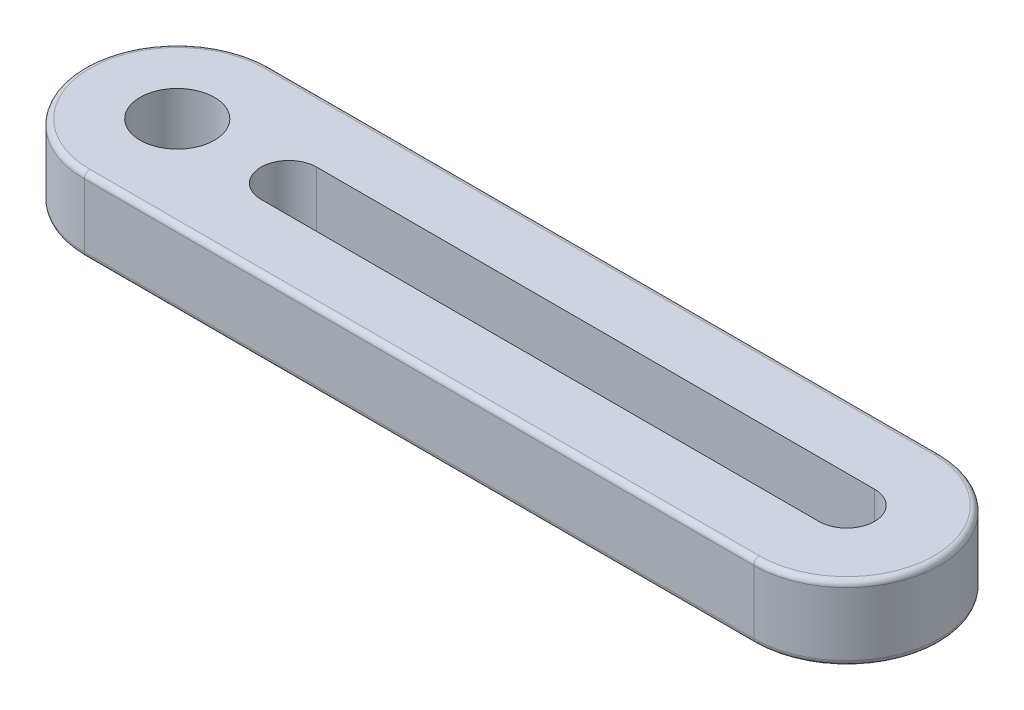
ISO-10303-21;
HEADER;
FILE_DESCRIPTION(('STEP AP214'),'2;1');
FILE_NAME('part.step','',(''),(''),'','','');
FILE_SCHEMA(('AUTOMOTIVE_DESIGN { 1 0 10303 214 1 1 1 1 }'));
ENDSEC;
DATA;
#1=APPLICATION_CONTEXT('core data for automotive mechanical design processes');
#2=APPLICATION_PROTOCOL_DEFINITION('international standard','automotive_design',2000,#1);
#3=PRODUCT_CONTEXT('',#1,'mechanical');
#4=PRODUCT('Part','Part','',(#3));
#5=PRODUCT_RELATED_PRODUCT_CATEGORY('part','',(#4));
#6=PRODUCT_DEFINITION_FORMATION('','',#4);
#7=PRODUCT_DEFINITION_CONTEXT('part definition',#1,'design');
#8=PRODUCT_DEFINITION('design','',#6,#7);
#9=PRODUCT_DEFINITION_SHAPE('','',#8);
#10=(LENGTH_UNIT() NAMED_UNIT(*) SI_UNIT(.MILLI.,.METRE.));
#11=(NAMED_UNIT(*) PLANE_ANGLE_UNIT() SI_UNIT($,.RADIAN.));
#12=(NAMED_UNIT(*) SI_UNIT($,.STERADIAN.) SOLID_ANGLE_UNIT());
#13=UNCERTAINTY_MEASURE_WITH_UNIT(LENGTH_MEASURE(1.E-05),#10,'distance_accuracy_value','');
#14=(GEOMETRIC_REPRESENTATION_CONTEXT(3) GLOBAL_UNCERTAINTY_ASSIGNED_CONTEXT((#13)) GLOBAL_UNIT_ASSIGNED_CONTEXT((#10,
#11,#12)) REPRESENTATION_CONTEXT('',''));
#15=CARTESIAN_POINT('',(0.,0.,0.));
#16=DIRECTION('',(0.,0.,1.));
#17=DIRECTION('',(1.,0.,0.));
#18=AXIS2_PLACEMENT_3D('',#15,#16,#17);
#19=CARTESIAN_POINT('',(0.,10.,0.));
#20=DIRECTION('',(0.,1.,0.));
#21=DIRECTION('',(0.,0.,1.));
#22=AXIS2_PLACEMENT_3D('',#19,#20,#21);
#23=PLANE('',#22);
#24=DIRECTION('',(1.,0.,0.));
#25=VECTOR('',#24,1.);
#26=CARTESIAN_POINT('',(180.,10.,23.5));
#27=LINE('',#26,#25);
#28=CARTESIAN_POINT('',(0.,10.,23.5));
#29=VERTEX_POINT('',#28);
#30=CARTESIAN_POINT('',(180.,10.,23.5));
#31=VERTEX_POINT('',#30);
#32=EDGE_CURVE('E51',#29,#31,#27,.T.);
#33=ORIENTED_EDGE('',*,*,#32,.T.);
#34=CARTESIAN_POINT('',(180.,10.,0.));
#35=DIRECTION('',(0.,1.,0.));
#36=DIRECTION('',(0.,0.,1.));
#37=AXIS2_PLACEMENT_3D('',#34,#35,#36);
#38=CIRCLE('',#37,23.5);
#39=CARTESIAN_POINT('',(180.,10.,-23.5));
#40=VERTEX_POINT('',#39);
#41=EDGE_CURVE('E211',#31,#40,#38,.T.);
#42=ORIENTED_EDGE('',*,*,#41,.T.);
#43=DIRECTION('',(-1.,0.,0.));
#44=VECTOR('',#43,1.);
#45=CARTESIAN_POINT('',(0.,10.,-23.5));
#46=LINE('',#45,#44);
#47=CARTESIAN_POINT('',(0.,10.,-23.5));
#48=VERTEX_POINT('',#47);
#49=EDGE_CURVE('E207',#40,#48,#46,.T.);
#50=ORIENTED_EDGE('',*,*,#49,.T.);
#51=CARTESIAN_POINT('',(0.,10.,0.));
#52=DIRECTION('',(0.,1.,0.));
#53=DIRECTION('',(0.,0.,1.));
#54=AXIS2_PLACEMENT_3D('',#51,#52,#53);
#55=CIRCLE('',#54,23.5);
#56=EDGE_CURVE('E56',#48,#29,#55,.T.);
#57=ORIENTED_EDGE('',*,*,#56,.T.);
#58=EDGE_LOOP('',(#33,#42,#50,#57));
#59=FACE_BOUND('',#58,.T.);
#60=CARTESIAN_POINT('',(0.,10.,0.));
#61=DIRECTION('',(0.,1.,0.));
#62=DIRECTION('',(0.,0.,1.));
#63=AXIS2_PLACEMENT_3D('',#60,#61,#62);
#64=CIRCLE('',#63,10.);
#65=CARTESIAN_POINT('',(0.,10.,10.));
#66=VERTEX_POINT('',#65);
#67=EDGE_CURVE('E167',#66,#66,#64,.T.);
#68=ORIENTED_EDGE('',*,*,#67,.F.);
#69=EDGE_LOOP('',(#68));
#70=FACE_BOUND('',#69,.T.);
#71=DIRECTION('',(1.,0.,0.));
#72=VECTOR('',#71,1.);
#73=CARTESIAN_POINT('',(30.,10.,7.5));
#74=LINE('',#73,#72);
#75=CARTESIAN_POINT('',(30.,10.,7.5));
#76=VERTEX_POINT('',#75);
#77=CARTESIAN_POINT('',(180.,10.,7.5));
#78=VERTEX_POINT('',#77);
#79=EDGE_CURVE('E135',#76,#78,#74,.T.);
#80=ORIENTED_EDGE('',*,*,#79,.F.);
#81=CARTESIAN_POINT('',(30.,10.,0.));
#82=DIRECTION('',(0.,1.,0.));
#83=DIRECTION('',(0.,0.,1.));
#84=AXIS2_PLACEMENT_3D('',#81,#82,#83);
#85=CIRCLE('',#84,7.5);
#86=CARTESIAN_POINT('',(30.,10.,-7.5));
#87=VERTEX_POINT('',#86);
#88=EDGE_CURVE('E125',#87,#76,#85,.T.);
#89=ORIENTED_EDGE('',*,*,#88,.F.);
#90=DIRECTION('',(-1.,0.,0.));
#91=VECTOR('',#90,1.);
#92=CARTESIAN_POINT('',(30.,10.,-7.5));
#93=LINE('',#92,#91);
#94=CARTESIAN_POINT('',(180.,10.,-7.5));
#95=VERTEX_POINT('',#94);
#96=EDGE_CURVE('E150',#95,#87,#93,.T.);
#97=ORIENTED_EDGE('',*,*,#96,.F.);
#98=CARTESIAN_POINT('',(180.,10.,0.));
#99=DIRECTION('',(0.,1.,0.));
#100=DIRECTION('',(0.,0.,1.));
#101=AXIS2_PLACEMENT_3D('',#98,#99,#100);
#102=CIRCLE('',#101,7.5);
#103=EDGE_CURVE('E148',#78,#95,#102,.T.);
#104=ORIENTED_EDGE('',*,*,#103,.F.);
#105=EDGE_LOOP('',(#80,#89,#97,#104));
#106=FACE_BOUND('',#105,.T.);
#107=ADVANCED_FACE('F34',(#59,#70,#106),#23,.T.);
#108=CARTESIAN_POINT('',(0.,-10.,0.));
#109=DIRECTION('',(0.,1.,0.));
#110=DIRECTION('',(0.,0.,1.));
#111=AXIS2_PLACEMENT_3D('',#108,#109,#110);
#112=PLANE('',#111);
#113=DIRECTION('',(1.,0.,0.));
#114=VECTOR('',#113,1.);
#115=CARTESIAN_POINT('',(0.,-10.,23.5));
#116=LINE('',#115,#114);
#117=CARTESIAN_POINT('',(180.,-10.,23.5));
#118=VERTEX_POINT('',#117);
#119=CARTESIAN_POINT('',(0.,-10.,23.5));
#120=VERTEX_POINT('',#119);
#121=EDGE_CURVE('E189',#118,#120,#116,.F.);
#122=ORIENTED_EDGE('',*,*,#121,.T.);
#123=CARTESIAN_POINT('',(0.,-10.,0.));
#124=DIRECTION('',(0.,1.,0.));
#125=DIRECTION('',(0.,0.,1.));
#126=AXIS2_PLACEMENT_3D('',#123,#124,#125);
#127=CIRCLE('',#126,23.5);
#128=CARTESIAN_POINT('',(0.,-10.,-23.5));
#129=VERTEX_POINT('',#128);
#130=EDGE_CURVE('E195',#120,#129,#127,.F.);
#131=ORIENTED_EDGE('',*,*,#130,.T.);
#132=DIRECTION('',(-1.,0.,0.));
#133=VECTOR('',#132,1.);
#134=CARTESIAN_POINT('',(0.,-10.,-23.5));
#135=LINE('',#134,#133);
#136=CARTESIAN_POINT('',(180.,-10.,-23.5));
#137=VERTEX_POINT('',#136);
#138=EDGE_CURVE('E193',#129,#137,#135,.F.);
#139=ORIENTED_EDGE('',*,*,#138,.T.);
#140=CARTESIAN_POINT('',(180.,-10.,0.));
#141=DIRECTION('',(0.,1.,0.));
#142=DIRECTION('',(0.,0.,1.));
#143=AXIS2_PLACEMENT_3D('',#140,#141,#142);
#144=CIRCLE('',#143,23.5);
#145=EDGE_CURVE('E191',#137,#118,#144,.F.);
#146=ORIENTED_EDGE('',*,*,#145,.T.);
#147=EDGE_LOOP('',(#122,#131,#139,#146));
#148=FACE_BOUND('',#147,.T.);
#149=CARTESIAN_POINT('',(0.,-10.,0.));
#150=DIRECTION('',(0.,1.,0.));
#151=DIRECTION('',(0.,0.,1.));
#152=AXIS2_PLACEMENT_3D('',#149,#150,#151);
#153=CIRCLE('',#152,10.);
#154=CARTESIAN_POINT('',(0.,-10.,10.));
#155=VERTEX_POINT('',#154);
#156=EDGE_CURVE('E143',#155,#155,#153,.T.);
#157=ORIENTED_EDGE('',*,*,#156,.T.);
#158=EDGE_LOOP('',(#157));
#159=FACE_BOUND('',#158,.T.);
#160=CARTESIAN_POINT('',(30.,-10.,0.));
#161=DIRECTION('',(0.,1.,0.));
#162=DIRECTION('',(0.,0.,1.));
#163=AXIS2_PLACEMENT_3D('',#160,#161,#162);
#164=CIRCLE('',#163,7.5);
#165=CARTESIAN_POINT('',(30.,-10.,-7.5));
#166=VERTEX_POINT('',#165);
#167=CARTESIAN_POINT('',(30.,-10.,7.5));
#168=VERTEX_POINT('',#167);
#169=EDGE_CURVE('E154',#166,#168,#164,.T.);
#170=ORIENTED_EDGE('',*,*,#169,.T.);
#171=DIRECTION('',(1.,0.,0.));
#172=VECTOR('',#171,1.);
#173=CARTESIAN_POINT('',(30.,-10.,7.5));
#174=LINE('',#173,#172);
#175=CARTESIAN_POINT('',(180.,-10.,7.5));
#176=VERTEX_POINT('',#175);
#177=EDGE_CURVE('E142',#168,#176,#174,.T.);
#178=ORIENTED_EDGE('',*,*,#177,.T.);
#179=CARTESIAN_POINT('',(180.,-10.,0.));
#180=DIRECTION('',(0.,1.,0.));
#181=DIRECTION('',(0.,0.,1.));
#182=AXIS2_PLACEMENT_3D('',#179,#180,#181);
#183=CIRCLE('',#182,7.5);
#184=CARTESIAN_POINT('',(180.,-10.,-7.5));
#185=VERTEX_POINT('',#184);
#186=EDGE_CURVE('E158',#176,#185,#183,.T.);
#187=ORIENTED_EDGE('',*,*,#186,.T.);
#188=DIRECTION('',(-1.,0.,0.));
#189=VECTOR('',#188,1.);
#190=CARTESIAN_POINT('',(30.,-10.,-7.5));
#191=LINE('',#190,#189);
#192=EDGE_CURVE('E136',#185,#166,#191,.T.);
#193=ORIENTED_EDGE('',*,*,#192,.T.);
#194=EDGE_LOOP('',(#170,#178,#187,#193));
#195=FACE_BOUND('',#194,.T.);
#196=ADVANCED_FACE('F272',(#148,#159,#195),#112,.F.);
#197=CARTESIAN_POINT('',(0.,10.,0.));
#198=DIRECTION('',(0.,-1.,0.));
#199=DIRECTION('',(0.,0.,-1.));
#200=AXIS2_PLACEMENT_3D('',#197,#198,#199);
#201=CYLINDRICAL_SURFACE('',#200,25.);
#202=DIRECTION('',(0.,-1.,0.));
#203=VECTOR('',#202,1.);
#204=CARTESIAN_POINT('',(0.,10.,-25.));
#205=LINE('',#204,#203);
#206=CARTESIAN_POINT('',(0.,8.5,-25.));
#207=VERTEX_POINT('',#206);
#208=CARTESIAN_POINT('',(0.,-8.5,-25.));
#209=VERTEX_POINT('',#208);
#210=EDGE_CURVE('E170',#207,#209,#205,.T.);
#211=ORIENTED_EDGE('',*,*,#210,.T.);
#212=CARTESIAN_POINT('',(0.,-8.5,0.));
#213=DIRECTION('',(0.,1.,0.));
#214=DIRECTION('',(0.,0.,1.));
#215=AXIS2_PLACEMENT_3D('',#212,#213,#214);
#216=CIRCLE('',#215,25.);
#217=CARTESIAN_POINT('',(0.,-8.5,25.));
#218=VERTEX_POINT('',#217);
#219=EDGE_CURVE('E186',#209,#218,#216,.T.);
#220=ORIENTED_EDGE('',*,*,#219,.T.);
#221=DIRECTION('',(0.,-1.,0.));
#222=VECTOR('',#221,1.);
#223=CARTESIAN_POINT('',(0.,10.,25.));
#224=LINE('',#223,#222);
#225=CARTESIAN_POINT('',(0.,8.5,25.));
#226=VERTEX_POINT('',#225);
#227=EDGE_CURVE('E181',#226,#218,#224,.T.);
#228=ORIENTED_EDGE('',*,*,#227,.F.);
#229=CARTESIAN_POINT('',(0.,8.5,0.));
#230=DIRECTION('',(0.,1.,0.));
#231=DIRECTION('',(0.,0.,1.));
#232=AXIS2_PLACEMENT_3D('',#229,#230,#231);
#233=CIRCLE('',#232,25.);
#234=EDGE_CURVE('E184',#226,#207,#233,.F.);
#235=ORIENTED_EDGE('',*,*,#234,.T.);
#236=EDGE_LOOP('',(#211,#220,#228,#235));
#237=FACE_BOUND('',#236,.T.);
#238=ADVANCED_FACE('F241',(#237),#201,.T.);
#239=CARTESIAN_POINT('',(0.,10.,25.));
#240=DIRECTION('',(0.,0.,-1.));
#241=DIRECTION('',(-1.,0.,0.));
#242=AXIS2_PLACEMENT_3D('',#239,#240,#241);
#243=PLANE('',#242);
#244=DIRECTION('',(0.,-1.,0.));
#245=VECTOR('',#244,1.);
#246=CARTESIAN_POINT('',(180.,10.,25.));
#247=LINE('',#246,#245);
#248=CARTESIAN_POINT('',(180.,8.5,25.));
#249=VERTEX_POINT('',#248);
#250=CARTESIAN_POINT('',(180.,-8.5,25.));
#251=VERTEX_POINT('',#250);
#252=EDGE_CURVE('E178',#249,#251,#247,.T.);
#253=ORIENTED_EDGE('',*,*,#252,.F.);
#254=DIRECTION('',(1.,0.,0.));
#255=VECTOR('',#254,1.);
#256=CARTESIAN_POINT('',(0.,8.5,25.));
#257=LINE('',#256,#255);
#258=EDGE_CURVE('E11',#249,#226,#257,.F.);
#259=ORIENTED_EDGE('',*,*,#258,.T.);
#260=ORIENTED_EDGE('',*,*,#227,.T.);
#261=DIRECTION('',(1.,0.,0.));
#262=VECTOR('',#261,1.);
#263=CARTESIAN_POINT('',(0.,-8.5,25.));
#264=LINE('',#263,#262);
#265=EDGE_CURVE('E43',#218,#251,#264,.T.);
#266=ORIENTED_EDGE('',*,*,#265,.T.);
#267=EDGE_LOOP('',(#253,#259,#260,#266));
#268=FACE_BOUND('',#267,.T.);
#269=ADVANCED_FACE('F259',(#268),#243,.F.);
#270=CARTESIAN_POINT('',(180.,10.,0.));
#271=DIRECTION('',(0.,-1.,0.));
#272=DIRECTION('',(0.,0.,-1.));
#273=AXIS2_PLACEMENT_3D('',#270,#271,#272);
#274=CYLINDRICAL_SURFACE('',#273,25.);
#275=ORIENTED_EDGE('',*,*,#252,.T.);
#276=CARTESIAN_POINT('',(180.,-8.5,0.));
#277=DIRECTION('',(0.,1.,0.));
#278=DIRECTION('',(0.,0.,1.));
#279=AXIS2_PLACEMENT_3D('',#276,#277,#278);
#280=CIRCLE('',#279,25.);
#281=CARTESIAN_POINT('',(180.,-8.5,-25.));
#282=VERTEX_POINT('',#281);
#283=EDGE_CURVE('E205',#251,#282,#280,.T.);
#284=ORIENTED_EDGE('',*,*,#283,.T.);
#285=DIRECTION('',(0.,-1.,0.));
#286=VECTOR('',#285,1.);
#287=CARTESIAN_POINT('',(180.,10.,-25.));
#288=LINE('',#287,#286);
#289=CARTESIAN_POINT('',(180.,8.5,-25.));
#290=VERTEX_POINT('',#289);
#291=EDGE_CURVE('E175',#290,#282,#288,.T.);
#292=ORIENTED_EDGE('',*,*,#291,.F.);
#293=CARTESIAN_POINT('',(180.,8.5,0.));
#294=DIRECTION('',(0.,1.,0.));
#295=DIRECTION('',(0.,0.,1.));
#296=AXIS2_PLACEMENT_3D('',#293,#294,#295);
#297=CIRCLE('',#296,25.);
#298=EDGE_CURVE('E202',#290,#249,#297,.F.);
#299=ORIENTED_EDGE('',*,*,#298,.T.);
#300=EDGE_LOOP('',(#275,#284,#292,#299));
#301=FACE_BOUND('',#300,.T.);
#302=ADVANCED_FACE('F262',(#301),#274,.T.);
#303=CARTESIAN_POINT('',(0.,10.,-25.));
#304=DIRECTION('',(0.,0.,1.));
#305=DIRECTION('',(1.,0.,0.));
#306=AXIS2_PLACEMENT_3D('',#303,#304,#305);
#307=PLANE('',#306);
#308=ORIENTED_EDGE('',*,*,#291,.T.);
#309=DIRECTION('',(-1.,0.,0.));
#310=VECTOR('',#309,1.);
#311=CARTESIAN_POINT('',(0.,-8.5,-25.));
#312=LINE('',#311,#310);
#313=EDGE_CURVE('E200',#282,#209,#312,.T.);
#314=ORIENTED_EDGE('',*,*,#313,.T.);
#315=ORIENTED_EDGE('',*,*,#210,.F.);
#316=DIRECTION('',(-1.,0.,0.));
#317=VECTOR('',#316,1.);
#318=CARTESIAN_POINT('',(180.,8.5,-25.));
#319=LINE('',#318,#317);
#320=EDGE_CURVE('E198',#207,#290,#319,.F.);
#321=ORIENTED_EDGE('',*,*,#320,.T.);
#322=EDGE_LOOP('',(#308,#314,#315,#321));
#323=FACE_BOUND('',#322,.T.);
#324=ADVANCED_FACE('F244',(#323),#307,.F.);
#325=CARTESIAN_POINT('',(0.,10.,0.));
#326=DIRECTION('',(0.,-1.,0.));
#327=DIRECTION('',(0.,0.,-1.));
#328=AXIS2_PLACEMENT_3D('',#325,#326,#327);
#329=CYLINDRICAL_SURFACE('',#328,10.);
#330=ORIENTED_EDGE('',*,*,#67,.T.);
#331=EDGE_LOOP('',(#330));
#332=FACE_BOUND('',#331,.T.);
#333=ORIENTED_EDGE('',*,*,#156,.F.);
#334=EDGE_LOOP('',(#333));
#335=FACE_BOUND('',#334,.T.);
#336=ADVANCED_FACE('F298',(#332,#335),#329,.F.);
#337=CARTESIAN_POINT('',(30.,10.,0.));
#338=DIRECTION('',(0.,-1.,0.));
#339=DIRECTION('',(0.,0.,-1.));
#340=AXIS2_PLACEMENT_3D('',#337,#338,#339);
#341=CYLINDRICAL_SURFACE('',#340,7.5);
#342=ORIENTED_EDGE('',*,*,#169,.F.);
#343=DIRECTION('',(0.,-1.,0.));
#344=VECTOR('',#343,1.);
#345=CARTESIAN_POINT('',(30.,10.,-7.5));
#346=LINE('',#345,#344);
#347=EDGE_CURVE('E131',#87,#166,#346,.T.);
#348=ORIENTED_EDGE('',*,*,#347,.F.);
#349=ORIENTED_EDGE('',*,*,#88,.T.);
#350=DIRECTION('',(0.,-1.,0.));
#351=VECTOR('',#350,1.);
#352=CARTESIAN_POINT('',(30.,10.,7.5));
#353=LINE('',#352,#351);
#354=EDGE_CURVE('E128',#76,#168,#353,.T.);
#355=ORIENTED_EDGE('',*,*,#354,.T.);
#356=EDGE_LOOP('',(#342,#348,#349,#355));
#357=FACE_BOUND('',#356,.T.);
#358=ADVANCED_FACE('F127',(#357),#341,.F.);
#359=CARTESIAN_POINT('',(30.,10.,7.5));
#360=DIRECTION('',(0.,0.,-1.));
#361=DIRECTION('',(-1.,0.,0.));
#362=AXIS2_PLACEMENT_3D('',#359,#360,#361);
#363=PLANE('',#362);
#364=ORIENTED_EDGE('',*,*,#177,.F.);
#365=ORIENTED_EDGE('',*,*,#354,.F.);
#366=ORIENTED_EDGE('',*,*,#79,.T.);
#367=DIRECTION('',(0.,-1.,0.));
#368=VECTOR('',#367,1.);
#369=CARTESIAN_POINT('',(180.,10.,7.5));
#370=LINE('',#369,#368);
#371=EDGE_CURVE('E144',#78,#176,#370,.T.);
#372=ORIENTED_EDGE('',*,*,#371,.T.);
#373=EDGE_LOOP('',(#364,#365,#366,#372));
#374=FACE_BOUND('',#373,.T.);
#375=ADVANCED_FACE('F139',(#374),#363,.T.);
#376=CARTESIAN_POINT('',(180.,10.,0.));
#377=DIRECTION('',(0.,-1.,0.));
#378=DIRECTION('',(0.,0.,-1.));
#379=AXIS2_PLACEMENT_3D('',#376,#377,#378);
#380=CYLINDRICAL_SURFACE('',#379,7.5);
#381=ORIENTED_EDGE('',*,*,#186,.F.);
#382=ORIENTED_EDGE('',*,*,#371,.F.);
#383=ORIENTED_EDGE('',*,*,#103,.T.);
#384=DIRECTION('',(0.,-1.,0.));
#385=VECTOR('',#384,1.);
#386=CARTESIAN_POINT('',(180.,10.,-7.5));
#387=LINE('',#386,#385);
#388=EDGE_CURVE('E164',#95,#185,#387,.T.);
#389=ORIENTED_EDGE('',*,*,#388,.T.);
#390=EDGE_LOOP('',(#381,#382,#383,#389));
#391=FACE_BOUND('',#390,.T.);
#392=ADVANCED_FACE('F283',(#391),#380,.F.);
#393=CARTESIAN_POINT('',(30.,10.,-7.5));
#394=DIRECTION('',(0.,0.,1.));
#395=DIRECTION('',(1.,0.,0.));
#396=AXIS2_PLACEMENT_3D('',#393,#394,#395);
#397=PLANE('',#396);
#398=ORIENTED_EDGE('',*,*,#192,.F.);
#399=ORIENTED_EDGE('',*,*,#388,.F.);
#400=ORIENTED_EDGE('',*,*,#96,.T.);
#401=ORIENTED_EDGE('',*,*,#347,.T.);
#402=EDGE_LOOP('',(#398,#399,#400,#401));
#403=FACE_BOUND('',#402,.T.);
#404=ADVANCED_FACE('F280',(#403),#397,.T.);
#405=CARTESIAN_POINT('',(180.,-8.5,0.));
#406=DIRECTION('',(0.,1.,0.));
#407=DIRECTION('',(0.,0.,1.));
#408=AXIS2_PLACEMENT_3D('',#405,#406,#407);
#409=TOROIDAL_SURFACE('',#408,23.5,1.5);
#410=CARTESIAN_POINT('',(180.,-8.5,23.5));
#411=DIRECTION('',(-1.,0.,0.));
#412=DIRECTION('',(0.,0.,1.));
#413=AXIS2_PLACEMENT_3D('',#410,#411,#412);
#414=CIRCLE('',#413,1.5);
#415=EDGE_CURVE('E218',#118,#251,#414,.T.);
#416=ORIENTED_EDGE('',*,*,#415,.F.);
#417=ORIENTED_EDGE('',*,*,#145,.F.);
#418=CARTESIAN_POINT('',(180.,-8.5,-23.5));
#419=DIRECTION('',(-1.,0.,0.));
#420=DIRECTION('',(0.,0.,1.));
#421=AXIS2_PLACEMENT_3D('',#418,#419,#420);
#422=CIRCLE('',#421,1.5);
#423=EDGE_CURVE('E156',#282,#137,#422,.T.);
#424=ORIENTED_EDGE('',*,*,#423,.F.);
#425=ORIENTED_EDGE('',*,*,#283,.F.);
#426=EDGE_LOOP('',(#416,#417,#424,#425));
#427=FACE_BOUND('',#426,.T.);
#428=ADVANCED_FACE('F266',(#427),#409,.T.);
#429=CARTESIAN_POINT('',(0.,-8.5,-23.5));
#430=DIRECTION('',(-1.,0.,0.));
#431=DIRECTION('',(0.,0.,1.));
#432=AXIS2_PLACEMENT_3D('',#429,#430,#431);
#433=CYLINDRICAL_SURFACE('',#432,1.5);
#434=ORIENTED_EDGE('',*,*,#423,.T.);
#435=ORIENTED_EDGE('',*,*,#138,.F.);
#436=CARTESIAN_POINT('',(0.,-8.5,-23.5));
#437=DIRECTION('',(-1.,0.,0.));
#438=DIRECTION('',(0.,0.,1.));
#439=AXIS2_PLACEMENT_3D('',#436,#437,#438);
#440=CIRCLE('',#439,1.5);
#441=EDGE_CURVE('E216',#209,#129,#440,.T.);
#442=ORIENTED_EDGE('',*,*,#441,.F.);
#443=ORIENTED_EDGE('',*,*,#313,.F.);
#444=EDGE_LOOP('',(#434,#435,#442,#443));
#445=FACE_BOUND('',#444,.T.);
#446=ADVANCED_FACE('F249',(#445),#433,.T.);
#447=CARTESIAN_POINT('',(0.,-8.5,23.5));
#448=DIRECTION('',(1.,0.,0.));
#449=DIRECTION('',(0.,0.,-1.));
#450=AXIS2_PLACEMENT_3D('',#447,#448,#449);
#451=CYLINDRICAL_SURFACE('',#450,1.5);
#452=ORIENTED_EDGE('',*,*,#415,.T.);
#453=ORIENTED_EDGE('',*,*,#265,.F.);
#454=CARTESIAN_POINT('',(0.,-8.5,23.5));
#455=DIRECTION('',(-1.,0.,0.));
#456=DIRECTION('',(0.,0.,1.));
#457=AXIS2_PLACEMENT_3D('',#454,#455,#456);
#458=CIRCLE('',#457,1.5);
#459=EDGE_CURVE('E214',#120,#218,#458,.T.);
#460=ORIENTED_EDGE('',*,*,#459,.F.);
#461=ORIENTED_EDGE('',*,*,#121,.F.);
#462=EDGE_LOOP('',(#452,#453,#460,#461));
#463=FACE_BOUND('',#462,.T.);
#464=ADVANCED_FACE('F270',(#463),#451,.T.);
#465=CARTESIAN_POINT('',(0.,-8.5,0.));
#466=DIRECTION('',(0.,1.,0.));
#467=DIRECTION('',(0.,0.,1.));
#468=AXIS2_PLACEMENT_3D('',#465,#466,#467);
#469=TOROIDAL_SURFACE('',#468,23.5,1.5);
#470=ORIENTED_EDGE('',*,*,#441,.T.);
#471=ORIENTED_EDGE('',*,*,#130,.F.);
#472=ORIENTED_EDGE('',*,*,#459,.T.);
#473=ORIENTED_EDGE('',*,*,#219,.F.);
#474=EDGE_LOOP('',(#470,#471,#472,#473));
#475=FACE_BOUND('',#474,.T.);
#476=ADVANCED_FACE('F254',(#475),#469,.T.);
#477=CARTESIAN_POINT('',(0.,8.5,0.));
#478=DIRECTION('',(0.,1.,0.));
#479=DIRECTION('',(0.,0.,1.));
#480=AXIS2_PLACEMENT_3D('',#477,#478,#479);
#481=TOROIDAL_SURFACE('',#480,23.5,1.5);
#482=CARTESIAN_POINT('',(0.,8.5,-23.5));
#483=DIRECTION('',(1.,0.,0.));
#484=DIRECTION('',(0.,0.,-1.));
#485=AXIS2_PLACEMENT_3D('',#482,#483,#484);
#486=CIRCLE('',#485,1.5);
#487=EDGE_CURVE('E226',#207,#48,#486,.T.);
#488=ORIENTED_EDGE('',*,*,#487,.F.);
#489=ORIENTED_EDGE('',*,*,#234,.F.);
#490=CARTESIAN_POINT('',(0.,8.5,23.5));
#491=DIRECTION('',(1.,0.,0.));
#492=DIRECTION('',(0.,0.,-1.));
#493=AXIS2_PLACEMENT_3D('',#490,#491,#492);
#494=CIRCLE('',#493,1.5);
#495=EDGE_CURVE('E38',#29,#226,#494,.T.);
#496=ORIENTED_EDGE('',*,*,#495,.F.);
#497=ORIENTED_EDGE('',*,*,#56,.F.);
#498=EDGE_LOOP('',(#488,#489,#496,#497));
#499=FACE_BOUND('',#498,.T.);
#500=ADVANCED_FACE('F36',(#499),#481,.T.);
#501=CARTESIAN_POINT('',(0.,8.5,23.5));
#502=DIRECTION('',(-1.,0.,0.));
#503=DIRECTION('',(0.,0.,1.));
#504=AXIS2_PLACEMENT_3D('',#501,#502,#503);
#505=CYLINDRICAL_SURFACE('',#504,1.5);
#506=ORIENTED_EDGE('',*,*,#495,.T.);
#507=ORIENTED_EDGE('',*,*,#258,.F.);
#508=CARTESIAN_POINT('',(180.,8.5,23.5));
#509=DIRECTION('',(1.,0.,0.));
#510=DIRECTION('',(0.,0.,-1.));
#511=AXIS2_PLACEMENT_3D('',#508,#509,#510);
#512=CIRCLE('',#511,1.5);
#513=EDGE_CURVE('E225',#31,#249,#512,.T.);
#514=ORIENTED_EDGE('',*,*,#513,.F.);
#515=ORIENTED_EDGE('',*,*,#32,.F.);
#516=EDGE_LOOP('',(#506,#507,#514,#515));
#517=FACE_BOUND('',#516,.T.);
#518=ADVANCED_FACE('F235',(#517),#505,.T.);
#519=CARTESIAN_POINT('',(0.,8.5,-23.5));
#520=DIRECTION('',(1.,0.,0.));
#521=DIRECTION('',(0.,0.,-1.));
#522=AXIS2_PLACEMENT_3D('',#519,#520,#521);
#523=CYLINDRICAL_SURFACE('',#522,1.5);
#524=ORIENTED_EDGE('',*,*,#487,.T.);
#525=ORIENTED_EDGE('',*,*,#49,.F.);
#526=CARTESIAN_POINT('',(180.,8.5,-23.5));
#527=DIRECTION('',(1.,0.,0.));
#528=DIRECTION('',(0.,0.,-1.));
#529=AXIS2_PLACEMENT_3D('',#526,#527,#528);
#530=CIRCLE('',#529,1.5);
#531=EDGE_CURVE('E223',#290,#40,#530,.T.);
#532=ORIENTED_EDGE('',*,*,#531,.F.);
#533=ORIENTED_EDGE('',*,*,#320,.F.);
#534=EDGE_LOOP('',(#524,#525,#532,#533));
#535=FACE_BOUND('',#534,.T.);
#536=ADVANCED_FACE('F320',(#535),#523,.T.);
#537=CARTESIAN_POINT('',(180.,8.5,0.));
#538=DIRECTION('',(0.,1.,0.));
#539=DIRECTION('',(0.,0.,1.));
#540=AXIS2_PLACEMENT_3D('',#537,#538,#539);
#541=TOROIDAL_SURFACE('',#540,23.5,1.5);
#542=ORIENTED_EDGE('',*,*,#513,.T.);
#543=ORIENTED_EDGE('',*,*,#298,.F.);
#544=ORIENTED_EDGE('',*,*,#531,.T.);
#545=ORIENTED_EDGE('',*,*,#41,.F.);
#546=EDGE_LOOP('',(#542,#543,#544,#545));
#547=FACE_BOUND('',#546,.T.);
#548=ADVANCED_FACE('F317',(#547),#541,.T.);
#549=CLOSED_SHELL('',(#107,#196,#238,#269,#302,#324,#336,#358,#375,#392,#404,#428,#446,#464,
#476,#500,#518,#536,#548));
#550=MANIFOLD_SOLID_BREP('B2',#549);
#551=ADVANCED_BREP_SHAPE_REPRESENTATION('',(#18,#550),#14);
#552=SHAPE_DEFINITION_REPRESENTATION(#9,#551);
ENDSEC;
END-ISO-10303-21;
